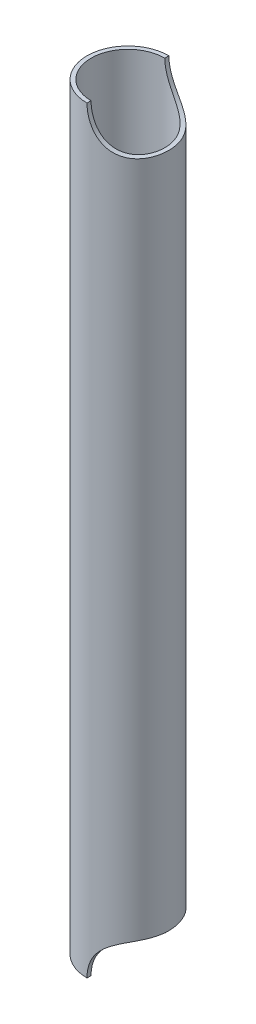
ISO-10303-21;
HEADER;
FILE_DESCRIPTION(('STEP AP214'),'2;1');
FILE_NAME('part.step','',(''),(''),'','','');
FILE_SCHEMA(('AUTOMOTIVE_DESIGN { 1 0 10303 214 1 1 1 1 }'));
ENDSEC;
DATA;
#1=APPLICATION_CONTEXT('core data for automotive mechanical design processes');
#2=APPLICATION_PROTOCOL_DEFINITION('international standard','automotive_design',2000,#1);
#3=PRODUCT_CONTEXT('',#1,'mechanical');
#4=PRODUCT('Part','Part','',(#3));
#5=PRODUCT_RELATED_PRODUCT_CATEGORY('part','',(#4));
#6=PRODUCT_DEFINITION_FORMATION('','',#4);
#7=PRODUCT_DEFINITION_CONTEXT('part definition',#1,'design');
#8=PRODUCT_DEFINITION('design','',#6,#7);
#9=PRODUCT_DEFINITION_SHAPE('','',#8);
#10=(LENGTH_UNIT() NAMED_UNIT(*) SI_UNIT(.MILLI.,.METRE.));
#11=(NAMED_UNIT(*) PLANE_ANGLE_UNIT() SI_UNIT($,.RADIAN.));
#12=(NAMED_UNIT(*) SI_UNIT($,.STERADIAN.) SOLID_ANGLE_UNIT());
#13=UNCERTAINTY_MEASURE_WITH_UNIT(LENGTH_MEASURE(1.E-05),#10,'distance_accuracy_value','');
#14=(GEOMETRIC_REPRESENTATION_CONTEXT(3) GLOBAL_UNCERTAINTY_ASSIGNED_CONTEXT((#13)) GLOBAL_UNIT_ASSIGNED_CONTEXT((#10,
#11,#12)) REPRESENTATION_CONTEXT('',''));
#15=CARTESIAN_POINT('',(0.,0.,0.));
#16=DIRECTION('',(0.,0.,1.));
#17=DIRECTION('',(1.,0.,0.));
#18=AXIS2_PLACEMENT_3D('',#15,#16,#17);
#19=CARTESIAN_POINT('',(0.,0.,0.));
#20=DIRECTION('',(0.,1.,0.));
#21=DIRECTION('',(0.,0.,1.));
#22=AXIS2_PLACEMENT_3D('',#19,#20,#21);
#23=PLANE('',#22);
#24=DIRECTION('',(0.,0.,1.));
#25=VECTOR('',#24,1.);
#26=CARTESIAN_POINT('',(0.,0.,-25.));
#27=LINE('',#26,#25);
#28=CARTESIAN_POINT('',(0.,0.,18.));
#29=VERTEX_POINT('',#28);
#30=CARTESIAN_POINT('',(0.,0.,20.));
#31=VERTEX_POINT('',#30);
#32=EDGE_CURVE('E56',#29,#31,#27,.T.);
#33=ORIENTED_EDGE('',*,*,#32,.T.);
#34=CARTESIAN_POINT('',(0.,0.,0.));
#35=DIRECTION('',(0.,1.,0.));
#36=DIRECTION('',(0.,0.,1.));
#37=AXIS2_PLACEMENT_3D('',#34,#35,#36);
#38=CIRCLE('',#37,20.);
#39=CARTESIAN_POINT('',(0.,0.,-20.));
#40=VERTEX_POINT('',#39);
#41=EDGE_CURVE('E97',#40,#31,#38,.T.);
#42=ORIENTED_EDGE('',*,*,#41,.F.);
#43=CARTESIAN_POINT('',(0.,0.,-18.));
#44=VERTEX_POINT('',#43);
#45=EDGE_CURVE('E87',#40,#44,#27,.T.);
#46=ORIENTED_EDGE('',*,*,#45,.T.);
#47=CARTESIAN_POINT('',(0.,0.,0.));
#48=DIRECTION('',(0.,1.,0.));
#49=DIRECTION('',(0.,0.,1.));
#50=AXIS2_PLACEMENT_3D('',#47,#48,#49);
#51=CIRCLE('',#50,18.);
#52=EDGE_CURVE('E102',#44,#29,#51,.T.);
#53=ORIENTED_EDGE('',*,*,#52,.T.);
#54=EDGE_LOOP('',(#33,#42,#46,#53));
#55=FACE_BOUND('',#54,.T.);
#56=ADVANCED_FACE('F34',(#55),#23,.F.);
#57=CARTESIAN_POINT('',(0.,370.,0.));
#58=DIRECTION('',(0.,-1.,0.));
#59=DIRECTION('',(0.,0.,-1.));
#60=AXIS2_PLACEMENT_3D('',#57,#58,#59);
#61=CYLINDRICAL_SURFACE('',#60,20.);
#62=CARTESIAN_POINT('',(0.,370.,0.));
#63=DIRECTION('',(0.,1.,0.));
#64=DIRECTION('',(0.,0.,1.));
#65=AXIS2_PLACEMENT_3D('',#62,#63,#64);
#66=CIRCLE('',#65,20.);
#67=CARTESIAN_POINT('',(0.,370.,-20.));
#68=VERTEX_POINT('',#67);
#69=CARTESIAN_POINT('',(0.,370.,20.));
#70=VERTEX_POINT('',#69);
#71=EDGE_CURVE('E92',#68,#70,#66,.T.);
#72=ORIENTED_EDGE('',*,*,#71,.F.);
#73=CARTESIAN_POINT('',(0.,370.,-20.));
#74=CARTESIAN_POINT('',(-3.06104600559937E-06,369.721618707315,-19.9999893506804));
#75=CARTESIAN_POINT('',(0.00581227517358233,369.443240815988,-19.9999997321841));
#76=CARTESIAN_POINT('',(0.029055060646602,368.886977421005,-19.9999850711208));
#77=CARTESIAN_POINT('',(0.0464822091236793,368.609091904782,-19.9999600294713));
#78=CARTESIAN_POINT('',(0.092923823321675,368.054285768103,-19.9997970442703));
#79=CARTESIAN_POINT('',(0.12193823082439,367.777365142806,-19.999659101286));
#80=CARTESIAN_POINT('',(0.19149481538049,367.224995071864,-19.9991128764201));
#81=CARTESIAN_POINT('',(0.232037268674741,366.949545661635,-19.99870458806));
#82=CARTESIAN_POINT('',(0.371039521708888,366.125124432942,-19.9967787556023));
#83=CARTESIAN_POINT('',(0.486803617486332,365.578922919936,-19.9945593607211));
#84=CARTESIAN_POINT('',(0.694297448400054,364.768584795034,-19.9880620741967));
#85=CARTESIAN_POINT('',(0.769106434341969,364.499957200638,-19.98536813534));
#86=CARTESIAN_POINT('',(0.929904514077298,363.965995909089,-19.9785325977727));
#87=CARTESIAN_POINT('',(1.01589676879598,363.700663166533,-19.9743905892075));
#88=CARTESIAN_POINT('',(1.29056947552188,362.909959500212,-19.9591640740678));
#89=CARTESIAN_POINT('',(1.49583821234951,362.390303410958,-19.9452811681699));
#90=CARTESIAN_POINT('',(1.94895280140816,361.370340198455,-19.9061104633644));
#91=CARTESIAN_POINT('',(2.19679599267575,360.870031868337,-19.8808233770736));
#92=CARTESIAN_POINT('',(2.59873676533621,360.13725797234,-19.8309032738408));
#93=CARTESIAN_POINT('',(2.73771900280118,359.89598937157,-19.812269365503));
#94=CARTESIAN_POINT('',(3.02539985532154,359.419814495336,-19.7703841714264));
#95=CARTESIAN_POINT('',(3.17409603898911,359.184906648448,-19.7471340381742));
#96=CARTESIAN_POINT('',(3.63428749109432,358.490366997608,-19.6694885800554));
#97=CARTESIAN_POINT('',(3.95993688558806,358.040825798644,-19.6071923537392));
#98=CARTESIAN_POINT('',(4.63170018762251,357.189935388517,-19.4592121823834));
#99=CARTESIAN_POINT('',(4.97652506439971,356.787391705802,-19.3745324010955));
#100=CARTESIAN_POINT('',(5.69312704219884,356.014617698228,-19.176194232153));
#101=CARTESIAN_POINT('',(6.0649035253786,355.644386633058,-19.0625365086422));
#102=CARTESIAN_POINT('',(6.82945421632089,354.939900589743,-18.8021639239921));
#103=CARTESIAN_POINT('',(7.2222008990967,354.605600106907,-18.6554916211243));
#104=CARTESIAN_POINT('',(8.02254971571631,353.975016895706,-18.3255518858566));
#105=CARTESIAN_POINT('',(8.43014925387275,353.678727565032,-18.1422908228785));
#106=CARTESIAN_POINT('',(9.19665424766341,353.163398877069,-17.7645285224411));
#107=CARTESIAN_POINT('',(9.5546275421295,352.939334546047,-17.5749608546811));
#108=CARTESIAN_POINT('',(10.2709734024261,352.520925692809,-17.1661609926113));
#109=CARTESIAN_POINT('',(10.6293459239999,352.32657815365,-16.9469318138972));
#110=CARTESIAN_POINT('',(11.3413874428653,351.967042238802,-16.4789096164042));
#111=CARTESIAN_POINT('',(11.695056188729,351.801855416076,-16.23011502429));
#112=CARTESIAN_POINT('',(12.392788825434,351.499325478486,-15.7038124287857));
#113=CARTESIAN_POINT('',(12.7368526597315,351.361982527508,-15.4263042564051));
#114=CARTESIAN_POINT('',(13.3913359878247,351.120377916521,-14.8609607175461));
#115=CARTESIAN_POINT('',(13.7025488779499,351.014658080903,-14.5746615457503));
#116=CARTESIAN_POINT('',(14.309277093163,350.824056780133,-13.9794555963432));
#117=CARTESIAN_POINT('',(14.6047932530538,350.739174205918,-13.6705500230952));
#118=CARTESIAN_POINT('',(15.1774684250058,350.587865943565,-13.0318260763331));
#119=CARTESIAN_POINT('',(15.4546236897073,350.521444014361,-12.7020034604842));
#120=CARTESIAN_POINT('',(15.9882767299572,350.404574274297,-12.0233683912128));
#121=CARTESIAN_POINT('',(16.2447730891725,350.354127557972,-11.6745546385391));
#122=CARTESIAN_POINT('',(16.7595566787178,350.262357977768,-10.9244730343548));
#123=CARTESIAN_POINT('',(17.015508494023,350.222432331692,-10.5214305407319));
#124=CARTESIAN_POINT('',(17.4983200494035,350.155579798451,-9.6972647505151));
#125=CARTESIAN_POINT('',(17.7251783442692,350.128653556843,-9.27614055710551));
#126=CARTESIAN_POINT('',(18.1483952912953,350.084758181751,-8.41811598721687));
#127=CARTESIAN_POINT('',(18.3447403806353,350.067793466813,-7.981208701043));
#128=CARTESIAN_POINT('',(18.705641326214,350.041107877916,-7.09424205112476));
#129=CARTESIAN_POINT('',(18.8701955678789,350.031387371802,-6.64418202072269));
#130=CARTESIAN_POINT('',(19.1851411427282,350.015907507505,-5.67632634272882));
#131=CARTESIAN_POINT('',(19.331185371609,350.0107958206,-5.15710045307549));
#132=CARTESIAN_POINT('',(19.5808749582457,350.004002075562,-4.10851128564528));
#133=CARTESIAN_POINT('',(19.6845171953678,350.002320269819,-3.57914726473863));
#134=CARTESIAN_POINT('',(19.8487237449098,350.000403123086,-2.51370598792182));
#135=CARTESIAN_POINT('',(19.9092827596959,350.000167959953,-1.97762791467719));
#136=CARTESIAN_POINT('',(19.9869050819649,349.999966752304,-0.90233661688352));
#137=CARTESIAN_POINT('',(20.0039682222223,350.000000708824,-0.363123380288917));
#138=CARTESIAN_POINT('',(19.9942882550485,349.999999292376,0.737255269632946));
#139=CARTESIAN_POINT('',(19.9657024475769,349.999960991164,1.29840537546465));
#140=CARTESIAN_POINT('',(19.8614334433283,350.000412535475,2.41632836046391));
#141=CARTESIAN_POINT('',(19.7857484344594,350.000902401318,2.97310107038117));
#142=CARTESIAN_POINT('',(19.587779689781,350.004003737293,4.07851456640564));
#143=CARTESIAN_POINT('',(19.4654784004514,350.006616007044,4.62715220827664));
#144=CARTESIAN_POINT('',(19.1751568657338,350.016489071947,5.71215658030807));
#145=CARTESIAN_POINT('',(19.0071368482487,350.023749843927,6.24852337162291));
#146=CARTESIAN_POINT('',(18.6264345512917,350.046311317273,7.30560160878698));
#147=CARTESIAN_POINT('',(18.4137088710125,350.061619853352,7.82629727520562));
#148=CARTESIAN_POINT('',(17.9453700253641,350.104428628878,8.8475559629032));
#149=CARTESIAN_POINT('',(17.6897560275427,350.131929104985,9.34811859317083));
#150=CARTESIAN_POINT('',(17.137960234046,350.203887039146,10.3249640353113));
#151=CARTESIAN_POINT('',(16.8417887830804,350.248340178344,10.8012529961305));
#152=CARTESIAN_POINT('',(16.2118378410108,350.359428392552,11.7255702821595));
#153=CARTESIAN_POINT('',(15.8780612792735,350.426061740555,12.1736008044127));
#154=CARTESIAN_POINT('',(15.19439235619,350.582923344904,13.0157500015868));
#155=CARTESIAN_POINT('',(14.846133933121,350.671809122032,13.4114430261319));
#156=CARTESIAN_POINT('',(14.1237218431699,350.879056707824,14.1702076914532));
#157=CARTESIAN_POINT('',(13.7495690170156,350.997417559829,14.5332803904527));
#158=CARTESIAN_POINT('',(12.9814631828314,351.267525874647,15.2232637309192));
#159=CARTESIAN_POINT('',(12.587537972895,351.419227424869,15.5502231816108));
#160=CARTESIAN_POINT('',(11.7860780944927,351.75936405567,16.1661265430257));
#161=CARTESIAN_POINT('',(11.3785457368549,351.947792925078,16.455076867875));
#162=CARTESIAN_POINT('',(10.6138684815525,352.334832703296,16.9565710680763));
#163=CARTESIAN_POINT('',(10.2575024228912,352.528478881242,17.1741577535538));
#164=CARTESIAN_POINT('',(9.54526037917844,352.945131073016,17.5799871132146));
#165=CARTESIAN_POINT('',(9.18938434733509,353.168134054027,17.7682328141992));
#166=CARTESIAN_POINT('',(8.4831078406835,353.643277622447,18.1160676509604));
#167=CARTESIAN_POINT('',(8.13270775675798,353.895420279209,18.2756547494894));
#168=CARTESIAN_POINT('',(7.44214510729254,354.42789764405,18.5675801558388));
#169=CARTESIAN_POINT('',(7.10198265995073,354.70823267746,18.6999181491589));
#170=CARTESIAN_POINT('',(6.45326770422073,355.280507287976,18.9332522024531));
#171=CARTESIAN_POINT('',(6.14398875756981,355.571114417551,19.0355075579297));
#172=CARTESIAN_POINT('',(5.54166626206664,356.174720078352,19.2194982160384));
#173=CARTESIAN_POINT('',(5.24862193953767,356.487717540915,19.3012344971836));
#174=CARTESIAN_POINT('',(4.68136548527225,357.134368520702,19.4466086654466));
#175=CARTESIAN_POINT('',(4.40715674165102,357.468025733754,19.5102433029014));
#176=CARTESIAN_POINT('',(3.87979781354684,358.154059084235,19.6219222927514));
#177=CARTESIAN_POINT('',(3.6266490078961,358.506436444836,19.6699656249521));
#178=CARTESIAN_POINT('',(3.11821096285406,359.265255757798,19.757277641847));
#179=CARTESIAN_POINT('',(2.86540048367341,359.673522946101,19.7951277832129));
#180=CARTESIAN_POINT('',(2.38945266276618,360.507930938412,19.8582014391863));
#181=CARTESIAN_POINT('',(2.16631726782058,360.934072912654,19.8834241256919));
#182=CARTESIAN_POINT('',(1.75106214407027,361.801961969699,19.9242904354029));
#183=CARTESIAN_POINT('',(1.55896159619756,362.243718499024,19.9399281512178));
#184=CARTESIAN_POINT('',(1.20708142532985,363.140110739525,19.9643198185056));
#185=CARTESIAN_POINT('',(1.04730324676047,363.594747025239,19.9730734623928));
#186=CARTESIAN_POINT('',(0.754557980330625,364.535010502068,19.9863226803634));
#187=CARTESIAN_POINT('',(0.623110034606531,365.02111424479,19.9906102521334));
#188=CARTESIAN_POINT('',(0.397239785224947,366.001866659971,19.9963737087501));
#189=CARTESIAN_POINT('',(0.302819207830794,366.496515729701,19.9978494625187));
#190=CARTESIAN_POINT('',(0.15159834042811,367.491254338028,19.999569262236));
#191=CARTESIAN_POINT('',(0.0947734171827032,367.991340095629,19.9998141153847));
#192=CARTESIAN_POINT('',(0.0379236439354409,368.743501938647,19.9999716442632));
#193=CARTESIAN_POINT('',(0.0237049866497329,368.99457924861,19.9999891892373));
#194=CARTESIAN_POINT('',(0.00474316660908787,369.497096196535,20.000000694534));
#195=CARTESIAN_POINT('',(1.83417679422026E-07,369.748535841272,19.9999946544098));
#196=CARTESIAN_POINT('',(0.,370.,20.));
#197=B_SPLINE_CURVE_WITH_KNOTS('',3,(#73,#74,#75,#76,#77,#78,#79,#80,#81,#82,#83,#84,#85,#86,
#87,#88,#89,#90,#91,#92,#93,#94,#95,#96,#97,#98,#99,#100,#101,#102,#103,#104,#105,#106,#107,
#108,#109,#110,#111,#112,#113,#114,#115,#116,#117,#118,#119,#120,#121,#122,#123,#124,#125,#126,
#127,#128,#129,#130,#131,#132,#133,#134,#135,#136,#137,#138,#139,#140,#141,#142,#143,#144,#145,
#146,#147,#148,#149,#150,#151,#152,#153,#154,#155,#156,#157,#158,#159,#160,#161,#162,#163,#164,
#165,#166,#167,#168,#169,#170,#171,#172,#173,#174,#175,#176,#177,#178,#179,#180,#181,#182,#183,
#184,#185,#186,#187,#188,#189,#190,#191,#192,#193,#194,#195,#196),.UNSPECIFIED.,.F.,.F.,(4,2,2,
2,2,2,2,2,2,2,2,2,2,2,2,2,2,2,2,2,2,2,2,2,2,2,2,2,2,2,2,2,2,2,2,2,2,2,2,2,2,2,2,2,2,2,2,2,2,2,2,
2,2,2,2,2,2,2,2,2,2,4),(0.,0.835076485595751,1.6701313413639,2.50518200159435,3.34025267341771,
5.01292525098713,5.8493179684489,6.68594760628963,8.3605041614688,10.0349560925573,
10.8718849415026,11.7086051049933,13.3817268500394,14.9897573907218,16.5977510803505,
18.2036836971141,19.8093369942811,21.1962193447255,22.5829608008564,23.9697760860677,
25.3565995336854,26.66286725989,27.9690654448479,29.2755294016961,30.5820828509762,
32.017952832629,33.4538941129742,34.8904718407489,36.3271225093717,37.9434994468826,
39.5599953225238,41.1766899326945,42.7933907584476,44.4770185595549,46.1607111404629,
47.8450383489246,49.5293571613503,51.2153187478653,52.9013130622821,54.5868781399788,
56.2723120060271,57.8736886662662,59.4750133580925,61.0741465729394,62.6730095832948,
64.0519717602324,65.4307915898356,66.8097093965347,68.1886431173551,69.496858735585,
70.8050119558087,72.1133998717578,73.4218733829236,74.8654742199874,76.3091697152418,
77.7537540937544,79.1984030137593,80.7076781862071,82.2170237146336,83.7253793152316,
84.479663807601,85.2339625934864),.UNSPECIFIED.);
#198=EDGE_CURVE('E79',#68,#70,#197,.T.);
#199=ORIENTED_EDGE('',*,*,#198,.T.);
#200=EDGE_LOOP('',(#72,#199));
#201=FACE_BOUND('',#200,.T.);
#202=CARTESIAN_POINT('',(0.,0.,-20.));
#203=CARTESIAN_POINT('',(-3.06104601949444E-06,0.278381292685202,-19.9999893506804));
#204=CARTESIAN_POINT('',(0.00581227517356356,0.556759184012306,-19.9999997321841));
#205=CARTESIAN_POINT('',(0.02905506064658,1.11302257899515,-19.9999850711208));
#206=CARTESIAN_POINT('',(0.0464822091236599,1.39090809521777,-19.9999600294713));
#207=CARTESIAN_POINT('',(0.0929238233216565,1.94571423189697,-19.9997970442703));
#208=CARTESIAN_POINT('',(0.12193823082437,2.22263485719443,-19.999659101286));
#209=CARTESIAN_POINT('',(0.191494815380472,2.7750049281359,-19.9991128764201));
#210=CARTESIAN_POINT('',(0.232037268674725,3.05045433836476,-19.99870458806));
#211=CARTESIAN_POINT('',(0.371039521708878,3.87487556705794,-19.9967787556023));
#212=CARTESIAN_POINT('',(0.486803617486322,4.42107708006374,-19.9945593607211));
#213=CARTESIAN_POINT('',(0.694297448400039,5.23141520496648,-19.9880620741967));
#214=CARTESIAN_POINT('',(0.76910643434195,5.50004279936197,-19.98536813534));
#215=CARTESIAN_POINT('',(0.92990451407728,6.03400409091147,-19.9785325977727));
#216=CARTESIAN_POINT('',(1.01589676879597,6.29933683346693,-19.9743905892075));
#217=CARTESIAN_POINT('',(1.29056947552188,7.09004049978803,-19.9591640740679));
#218=CARTESIAN_POINT('',(1.4958382123495,7.60969658904237,-19.9452811681699));
#219=CARTESIAN_POINT('',(1.94895280140815,8.62965980154511,-19.9061104633644));
#220=CARTESIAN_POINT('',(2.19679599267574,9.12996813166293,-19.8808233770736));
#221=CARTESIAN_POINT('',(2.5987367653362,9.86274202766004,-19.8309032738408));
#222=CARTESIAN_POINT('',(2.73771900280116,10.1040106284301,-19.812269365503));
#223=CARTESIAN_POINT('',(3.02539985532152,10.5801855046641,-19.7703841714264));
#224=CARTESIAN_POINT('',(3.17409603898909,10.8150933515522,-19.7471340381742));
#225=CARTESIAN_POINT('',(3.6342874910943,11.5096330023915,-19.6694885800554));
#226=CARTESIAN_POINT('',(3.95993688558805,11.9591742013562,-19.6071923537392));
#227=CARTESIAN_POINT('',(4.63170018762252,12.8100646114835,-19.4592121823834));
#228=CARTESIAN_POINT('',(4.97652506439972,13.2126082941977,-19.3745324010955));
#229=CARTESIAN_POINT('',(5.69312704219885,13.9853823017717,-19.176194232153));
#230=CARTESIAN_POINT('',(6.06490352537861,14.3556133669417,-19.0625365086422));
#231=CARTESIAN_POINT('',(6.8294542163209,15.0600994102571,-18.8021639239921));
#232=CARTESIAN_POINT('',(7.22220089909671,15.3943998930928,-18.6554916211243));
#233=CARTESIAN_POINT('',(8.02254971571634,16.0249831042939,-18.3255518858566));
#234=CARTESIAN_POINT('',(8.43014925387278,16.321272434968,-18.1422908228785));
#235=CARTESIAN_POINT('',(9.19665424766344,16.8366011229314,-17.7645285224411));
#236=CARTESIAN_POINT('',(9.55462754212953,17.0606654539532,-17.5749608546811));
#237=CARTESIAN_POINT('',(10.2709734024262,17.4790743071909,-17.1661609926113));
#238=CARTESIAN_POINT('',(10.6293459239999,17.6734218463498,-16.9469318138972));
#239=CARTESIAN_POINT('',(11.3413874428653,18.032957761198,-16.4789096164042));
#240=CARTESIAN_POINT('',(11.6950561887291,18.1981445839244,-16.23011502429));
#241=CARTESIAN_POINT('',(12.392788825434,18.5006745215145,-15.7038124287856));
#242=CARTESIAN_POINT('',(12.7368526597315,18.6380174724922,-15.4263042564051));
#243=CARTESIAN_POINT('',(13.3913359878247,18.8796220834792,-14.8609607175461));
#244=CARTESIAN_POINT('',(13.7025488779499,18.9853419190975,-14.5746615457503));
#245=CARTESIAN_POINT('',(14.309277093163,19.1759432198669,-13.9794555963432));
#246=CARTESIAN_POINT('',(14.6047932530538,19.2608257940823,-13.6705500230952));
#247=CARTESIAN_POINT('',(15.1774684250058,19.4121340564348,-13.0318260763331));
#248=CARTESIAN_POINT('',(15.4546236897074,19.4785559856388,-12.7020034604842));
#249=CARTESIAN_POINT('',(15.9882767299572,19.5954257257029,-12.0233683912128));
#250=CARTESIAN_POINT('',(16.2447730891725,19.6458724420284,-11.6745546385391));
#251=CARTESIAN_POINT('',(16.7595566787178,19.7376420222323,-10.9244730343547));
#252=CARTESIAN_POINT('',(17.015508494023,19.777567668308,-10.5214305407319));
#253=CARTESIAN_POINT('',(17.4983200494035,19.8444202015488,-9.69726475051509));
#254=CARTESIAN_POINT('',(17.7251783442692,19.871346443157,-9.27614055710549));
#255=CARTESIAN_POINT('',(18.1483952912953,19.9152418182489,-8.41811598721685));
#256=CARTESIAN_POINT('',(18.3447403806353,19.9322065331873,-7.98120870104298));
#257=CARTESIAN_POINT('',(18.7056413262141,19.9588921220835,-7.09424205112473));
#258=CARTESIAN_POINT('',(18.8701955678789,19.9686126281985,-6.64418202072266));
#259=CARTESIAN_POINT('',(19.1851411427282,19.9840924924952,-5.67632634272878));
#260=CARTESIAN_POINT('',(19.331185371609,19.9892041793999,-5.15710045307546));
#261=CARTESIAN_POINT('',(19.5808749582457,19.9959979244382,-4.10851128564524));
#262=CARTESIAN_POINT('',(19.6845171953678,19.9976797301811,-3.57914726473858));
#263=CARTESIAN_POINT('',(19.8487237449098,19.9995968769138,-2.51370598792177));
#264=CARTESIAN_POINT('',(19.9092827596959,19.9998320400474,-1.97762791467715));
#265=CARTESIAN_POINT('',(19.9869050819649,20.0000332476958,-0.902336616883479));
#266=CARTESIAN_POINT('',(20.0039682222223,19.9999992911758,-0.363123380288873));
#267=CARTESIAN_POINT('',(19.9942882550485,20.0000007076244,0.73725526963299));
#268=CARTESIAN_POINT('',(19.9657024475769,20.0000390088359,1.29840537546469));
#269=CARTESIAN_POINT('',(19.8614334433283,19.9995874645255,2.41632836046395));
#270=CARTESIAN_POINT('',(19.7857484344593,19.9990975986823,2.97310107038121));
#271=CARTESIAN_POINT('',(19.587779689781,19.9959962627067,4.07851456640568));
#272=CARTESIAN_POINT('',(19.4654784004514,19.993383992956,4.62715220827668));
#273=CARTESIAN_POINT('',(19.1751568657338,19.9835109280529,5.71215658030811));
#274=CARTESIAN_POINT('',(19.0071368482487,19.9762501560726,6.24852337162295));
#275=CARTESIAN_POINT('',(18.6264345512917,19.9536886827268,7.30560160878702));
#276=CARTESIAN_POINT('',(18.4137088710125,19.9383801466485,7.82629727520566));
#277=CARTESIAN_POINT('',(17.945370025364,19.8955713711223,8.84755596290323));
#278=CARTESIAN_POINT('',(17.6897560275427,19.8680708950147,9.34811859317087));
#279=CARTESIAN_POINT('',(17.1379602340459,19.7961129608543,10.3249640353114));
#280=CARTESIAN_POINT('',(16.8417887830804,19.7516598216563,10.8012529961305));
#281=CARTESIAN_POINT('',(16.2118378410108,19.640571607448,11.7255702821595));
#282=CARTESIAN_POINT('',(15.8780612792735,19.5739382594446,12.1736008044127));
#283=CARTESIAN_POINT('',(15.19439235619,19.4170766550962,13.0157500015868));
#284=CARTESIAN_POINT('',(14.846133933121,19.3281908779681,13.4114430261319));
#285=CARTESIAN_POINT('',(14.1237218431698,19.1209432921757,14.1702076914532));
#286=CARTESIAN_POINT('',(13.7495690170155,19.0025824401711,14.5332803904527));
#287=CARTESIAN_POINT('',(12.9814631828314,18.7324741253526,15.2232637309192));
#288=CARTESIAN_POINT('',(12.587537972895,18.5807725751311,15.5502231816108));
#289=CARTESIAN_POINT('',(11.7860780944927,18.2406359443297,16.1661265430257));
#290=CARTESIAN_POINT('',(11.3785457368549,18.0522070749215,16.455076867875));
#291=CARTESIAN_POINT('',(10.6138684815525,17.665167296704,16.9565710680763));
#292=CARTESIAN_POINT('',(10.2575024228912,17.471521118758,17.1741577535539));
#293=CARTESIAN_POINT('',(9.54526037917844,17.0548689269842,17.5799871132146));
#294=CARTESIAN_POINT('',(9.18938434733508,16.8318659459734,17.7682328141992));
#295=CARTESIAN_POINT('',(8.48310784068348,16.3567223775534,18.1160676509605));
#296=CARTESIAN_POINT('',(8.13270775675795,16.1045797207908,18.2756547494895));
#297=CARTESIAN_POINT('',(7.44214510729251,15.57210235595,18.5675801558388));
#298=CARTESIAN_POINT('',(7.10198265995071,15.2917673225403,18.6999181491589));
#299=CARTESIAN_POINT('',(6.4532677042207,14.7194927120237,18.9332522024531));
#300=CARTESIAN_POINT('',(6.14398875756976,14.4288855824493,19.0355075579297));
#301=CARTESIAN_POINT('',(5.54166626206659,13.8252799216477,19.2194982160384));
#302=CARTESIAN_POINT('',(5.24862193953763,13.5122824590852,19.3012344971836));
#303=CARTESIAN_POINT('',(4.68136548527223,12.8656314792981,19.4466086654466));
#304=CARTESIAN_POINT('',(4.407156741651,12.5319742662461,19.5102433029014));
#305=CARTESIAN_POINT('',(3.87979781354681,11.8459409157647,19.6219222927514));
#306=CARTESIAN_POINT('',(3.62664900789607,11.4935635551644,19.6699656249521));
#307=CARTESIAN_POINT('',(3.11821096285403,10.7347442422023,19.757277641847));
#308=CARTESIAN_POINT('',(2.86540048367339,10.326477053899,19.7951277832129));
#309=CARTESIAN_POINT('',(2.38945266276615,9.49206906158783,19.8582014391863));
#310=CARTESIAN_POINT('',(2.16631726782055,9.06592708734645,19.8834241256919));
#311=CARTESIAN_POINT('',(1.75106214407024,8.19803803030058,19.9242904354029));
#312=CARTESIAN_POINT('',(1.55896159619753,7.75628150097601,19.9399281512178));
#313=CARTESIAN_POINT('',(1.20708142532983,6.85988926047467,19.9643198185056));
#314=CARTESIAN_POINT('',(1.04730324676044,6.4052529747605,19.9730734623928));
#315=CARTESIAN_POINT('',(0.754557980330594,5.46498949793172,19.9863226803634));
#316=CARTESIAN_POINT('',(0.623110034606501,4.97888575520966,19.9906102521334));
#317=CARTESIAN_POINT('',(0.397239785224924,3.99813334002903,19.9963737087501));
#318=CARTESIAN_POINT('',(0.302819207830774,3.50348427029856,19.9978494625187));
#319=CARTESIAN_POINT('',(0.151598340428092,2.50874566197214,19.999569262236));
#320=CARTESIAN_POINT('',(0.0947734171826853,2.00865990437073,19.9998141153847));
#321=CARTESIAN_POINT('',(0.0379236439354251,1.25649806135333,19.9999716442632));
#322=CARTESIAN_POINT('',(0.0237049866497183,1.00542075138969,19.9999891892373));
#323=CARTESIAN_POINT('',(0.0047431666090721,0.502903803465075,20.000000694534));
#324=CARTESIAN_POINT('',(1.8341766284555E-07,0.25146415872824,19.9999946544098));
#325=CARTESIAN_POINT('',(0.,0.,20.));
#326=B_SPLINE_CURVE_WITH_KNOTS('',3,(#202,#203,#204,#205,#206,#207,#208,#209,#210,#211,#212,
#213,#214,#215,#216,#217,#218,#219,#220,#221,#222,#223,#224,#225,#226,#227,#228,#229,#230,#231,
#232,#233,#234,#235,#236,#237,#238,#239,#240,#241,#242,#243,#244,#245,#246,#247,#248,#249,#250,
#251,#252,#253,#254,#255,#256,#257,#258,#259,#260,#261,#262,#263,#264,#265,#266,#267,#268,#269,
#270,#271,#272,#273,#274,#275,#276,#277,#278,#279,#280,#281,#282,#283,#284,#285,#286,#287,#288,
#289,#290,#291,#292,#293,#294,#295,#296,#297,#298,#299,#300,#301,#302,#303,#304,#305,#306,#307,
#308,#309,#310,#311,#312,#313,#314,#315,#316,#317,#318,#319,#320,#321,#322,#323,#324,#325),
.UNSPECIFIED.,.F.,.F.,(4,2,2,2,2,2,2,2,2,2,2,2,2,2,2,2,2,2,2,2,2,2,2,2,2,2,2,2,2,2,2,2,2,2,2,2,
2,2,2,2,2,2,2,2,2,2,2,2,2,2,2,2,2,2,2,2,2,2,2,2,2,4),(0.,0.835076485595706,1.67013134136387,
2.50518200159437,3.34025267341771,5.01292525098716,5.84931796844893,6.68594760628965,
8.36050416146882,10.0349560925573,10.8718849415026,11.7086051049933,13.3817268500394,
14.9897573907218,16.5977510803505,18.2036836971142,19.8093369942812,21.1962193447256,
22.5829608008565,23.9697760860677,25.3565995336854,26.66286725989,27.9690654448479,
29.2755294016961,30.5820828509762,32.017952832629,33.4538941129742,34.8904718407489,
36.3271225093718,37.9434994468826,39.5599953225238,41.1766899326946,42.7933907584477,
44.4770185595549,46.1607111404629,47.8450383489246,49.5293571613504,51.2153187478653,
52.9013130622822,54.5868781399788,56.2723120060271,57.8736886662663,59.4750133580926,
61.0741465729394,62.6730095832949,64.0519717602324,65.4307915898356,66.8097093965348,
68.1886431173551,69.496858735585,70.8050119558088,72.1133998717579,73.4218733829236,
74.8654742199874,76.3091697152419,77.7537540937545,79.1984030137594,80.7076781862072,
82.2170237146337,83.7253793152317,84.4796638076009,85.2339625934864),.UNSPECIFIED.);
#327=EDGE_CURVE('E86',#40,#31,#326,.T.);
#328=ORIENTED_EDGE('',*,*,#327,.F.);
#329=ORIENTED_EDGE('',*,*,#41,.T.);
#330=EDGE_LOOP('',(#328,#329));
#331=FACE_BOUND('',#330,.T.);
#332=ADVANCED_FACE('F36',(#201,#331),#61,.T.);
#333=CARTESIAN_POINT('',(0.,370.,0.));
#334=DIRECTION('',(0.,-1.,0.));
#335=DIRECTION('',(0.,0.,-1.));
#336=AXIS2_PLACEMENT_3D('',#333,#334,#335);
#337=CYLINDRICAL_SURFACE('',#336,18.);
#338=CARTESIAN_POINT('',(0.,370.,-18.));
#339=CARTESIAN_POINT('',(-3.06925014369441E-06,369.721361472762,-17.9999881249312));
#340=CARTESIAN_POINT('',(0.00582302296922062,369.44272636963,-17.999999701963));
#341=CARTESIAN_POINT('',(0.0291087567421984,368.885950157997,-17.9999833503419));
#342=CARTESIAN_POINT('',(0.0465680863538542,368.607809036451,-17.9999554227483));
#343=CARTESIAN_POINT('',(0.0930959103281516,368.052488326723,-17.9997736591112));
#344=CARTESIAN_POINT('',(0.12216459758597,367.775308754595,-17.9996198209755));
#345=CARTESIAN_POINT('',(0.191851347258406,367.222424801479,-17.9990106249913));
#346=CARTESIAN_POINT('',(0.232469699110668,366.946720457638,-17.998555259586));
#347=CARTESIAN_POINT('',(0.371843064464254,366.120884793345,-17.9964057312382));
#348=CARTESIAN_POINT('',(0.487989994296174,365.57354015662,-17.9939263714461));
#349=CARTESIAN_POINT('',(0.696197172849964,364.761547635674,-17.9866621957028));
#350=CARTESIAN_POINT('',(0.771266388630648,364.492380753156,-17.9836498251702));
#351=CARTESIAN_POINT('',(0.932630184598965,363.957361140536,-17.9760044623381));
#352=CARTESIAN_POINT('',(1.01892804815866,363.691509404832,-17.9713709953414));
#353=CARTESIAN_POINT('',(1.29465976446467,362.899064428516,-17.9543297167767));
#354=CARTESIAN_POINT('',(1.50076387552661,362.378235856911,-17.9387846509949));
#355=CARTESIAN_POINT('',(1.95570665872602,361.356142291994,-17.8948979891677));
#356=CARTESIAN_POINT('',(2.20454179729865,360.854875685243,-17.8665574509052));
#357=CARTESIAN_POINT('',(2.60783620182549,360.121211656816,-17.8106010507744));
#358=CARTESIAN_POINT('',(2.74716037454368,359.879868254942,-17.7897284023734));
#359=CARTESIAN_POINT('',(3.03550546906459,359.403615550243,-17.7428028294065));
#360=CARTESIAN_POINT('',(3.18452408749357,359.168704737764,-17.7167511323661));
#361=CARTESIAN_POINT('',(3.49185444053671,358.705829120378,-17.6587484376575));
#362=CARTESIAN_POINT('',(3.65016503003444,358.477863464807,-17.6267981658763));
#363=CARTESIAN_POINT('',(3.97560604776202,358.029386553697,-17.5562604770313));
#364=CARTESIAN_POINT('',(4.14273652974947,357.808875343606,-17.5176730195104));
#365=CARTESIAN_POINT('',(4.58534653747765,357.249330426654,-17.4084085692725));
#366=CARTESIAN_POINT('',(4.86710175935302,356.916285119263,-17.3321516660706));
#367=CARTESIAN_POINT('',(5.44868361132961,356.272385151773,-17.1582031044604));
#368=CARTESIAN_POINT('',(5.74850775547882,355.961527451864,-17.060514389815));
#369=CARTESIAN_POINT('',(6.36280806167282,355.364071164976,-16.8410494277227));
#370=CARTESIAN_POINT('',(6.67727474633584,355.077457215547,-16.7192885997263));
#371=CARTESIAN_POINT('',(7.31712549030267,354.529965056506,-16.4493224962811));
#372=CARTESIAN_POINT('',(7.64250970725025,354.269087218724,-16.3011168388486));
#373=CARTESIAN_POINT('',(8.30117104258407,353.773229708198,-15.9757951324046));
#374=CARTESIAN_POINT('',(8.63447673582811,353.53836985552,-15.7985539467664));
#375=CARTESIAN_POINT('',(9.3026196605845,353.096554322771,-15.4145934895463));
#376=CARTESIAN_POINT('',(9.63745689257065,352.889598651333,-15.207874208844));
#377=CARTESIAN_POINT('',(10.3035331794917,352.503521675463,-14.7647285300713));
#378=CARTESIAN_POINT('',(10.6347720200275,352.324402021188,-14.5283003723213));
#379=CARTESIAN_POINT('',(11.2885655588601,351.993189487528,-14.0263361935859));
#380=CARTESIAN_POINT('',(11.6111205781975,351.841095607834,-13.7608012505232));
#381=CARTESIAN_POINT('',(12.2197485614721,351.572570435208,-13.2223530267793));
#382=CARTESIAN_POINT('',(12.5067655865673,351.454345986267,-12.9513944140278));
#383=CARTESIAN_POINT('',(13.0659332646634,351.2381081072,-12.3870560805402));
#384=CARTESIAN_POINT('',(13.3380847489945,351.140093546017,-12.0936776158019));
#385=CARTESIAN_POINT('',(13.8646856170903,350.962269143566,-11.4861715021085));
#386=CARTESIAN_POINT('',(14.1191315324358,350.882462862256,-11.1720398110792));
#387=CARTESIAN_POINT('',(14.6078475923962,350.738910268666,-10.5249800387698));
#388=CARTESIAN_POINT('',(14.8421165991417,350.675164861743,-10.192050899165));
#389=CARTESIAN_POINT('',(15.3018269975782,350.558118165743,-9.4889871234255));
#390=CARTESIAN_POINT('',(15.5259033233561,350.50566910622,-9.11781812541133));
#391=CARTESIAN_POINT('',(15.947249652636,350.41373622281,-8.35904205460204));
#392=CARTESIAN_POINT('',(16.1445189171793,350.374252756288,-7.97143452905156));
#393=CARTESIAN_POINT('',(16.5108264761527,350.305828007752,-7.18206068702038));
#394=CARTESIAN_POINT('',(16.6798555433083,350.276890167809,-6.78028979448963));
#395=CARTESIAN_POINT('',(16.9884583262353,350.227417019611,-5.96508745316545));
#396=CARTESIAN_POINT('',(17.1280306206634,350.206882116769,-5.55165544279239));
#397=CARTESIAN_POINT('',(17.3895505655931,350.17060838472,-4.6727549768762));
#398=CARTESIAN_POINT('',(17.5082411623151,350.155573809234,-4.20628522485121));
#399=CARTESIAN_POINT('',(17.7079087965812,350.131521754172,-3.26517929536936));
#400=CARTESIAN_POINT('',(17.7888835312468,350.122504642,-2.79054262108578));
#401=CARTESIAN_POINT('',(17.9125692172282,350.109134924978,-1.83614859982725));
#402=CARTESIAN_POINT('',(17.9552726725206,350.10478323389,-1.35639026830889));
#403=CARTESIAN_POINT('',(18.0021008680016,350.100026462386,-0.394977216725632));
#404=CARTESIAN_POINT('',(18.0062252308356,350.099621420573,0.0866775218425289));
#405=CARTESIAN_POINT('',(17.975221941682,350.102750058323,1.06912174123733));
#406=CARTESIAN_POINT('',(17.9384267897655,350.106451046461,1.56985893261166));
#407=CARTESIAN_POINT('',(17.8231558597604,350.118735083873,2.56646871423187));
#408=CARTESIAN_POINT('',(17.7446785180716,350.127318316293,3.06234112127714));
#409=CARTESIAN_POINT('',(17.5465968543706,350.150799649019,4.04581494081285));
#410=CARTESIAN_POINT('',(17.4269801154351,350.165699656205,4.53341380945862));
#411=CARTESIAN_POINT('',(17.1475533508849,350.203954484899,5.49662285979792));
#412=CARTESIAN_POINT('',(16.9877437615808,350.227309214629,5.97223317157071));
#413=CARTESIAN_POINT('',(16.6295545000476,350.285210254453,6.90710137456273));
#414=CARTESIAN_POINT('',(16.4312399003386,350.319737747574,7.3663853289732));
#415=CARTESIAN_POINT('',(15.9976624403756,350.403316339616,8.26583437827707));
#416=CARTESIAN_POINT('',(15.7623990789719,350.452367635538,8.70599921374739));
#417=CARTESIAN_POINT('',(15.2574563830662,350.568702105566,9.56333485188014));
#418=CARTESIAN_POINT('',(14.9877942929313,350.635976163306,9.98051702691477));
#419=CARTESIAN_POINT('',(14.4171320149448,350.792733820603,10.7884576430662));
#420=CARTESIAN_POINT('',(14.1161345053303,350.882215522977,11.1792183377247));
#421=CARTESIAN_POINT('',(13.5054930817786,351.081271949573,11.9085820256059));
#422=CARTESIAN_POINT('',(13.1974125575568,351.189345898497,12.2489028289765));
#423=CARTESIAN_POINT('',(12.5613339750415,351.431693445744,12.9003909399301));
#424=CARTESIAN_POINT('',(12.2333368170501,351.56596586041,13.21155956368));
#425=CARTESIAN_POINT('',(11.5627276768665,351.863110247651,13.8022760533833));
#426=CARTESIAN_POINT('',(11.2201291799745,352.025956246152,14.0818522613491));
#427=CARTESIAN_POINT('',(10.5257045812935,352.382114682756,14.6081932954334));
#428=CARTESIAN_POINT('',(10.1738793773758,352.575424165494,14.8549613001098));
#429=CARTESIAN_POINT('',(9.50471329525693,352.971095583302,15.2906018879319));
#430=CARTESIAN_POINT('',(9.18768914292045,353.170302336548,15.4828412728603));
#431=CARTESIAN_POINT('',(8.5554683123148,353.593678648719,15.8409574036602));
#432=CARTESIAN_POINT('',(8.24027148810207,353.817846184378,16.0068362836165));
#433=CARTESIAN_POINT('',(7.6158317086446,354.290583657334,16.3131883362843));
#434=CARTESIAN_POINT('',(7.30658971987013,354.539157516511,16.4536574155243));
#435=CARTESIAN_POINT('',(6.697941267798,355.059599238663,16.7106775217486));
#436=CARTESIAN_POINT('',(6.39853516389779,355.331467951512,16.8272276755642));
#437=CARTESIAN_POINT('',(5.81338357665327,355.896626650584,17.0382273013846));
#438=CARTESIAN_POINT('',(5.52761854367506,356.189884359162,17.1327092062185));
#439=CARTESIAN_POINT('',(4.97212917711911,356.796505821659,17.3020885688024));
#440=CARTESIAN_POINT('',(4.7024046858415,357.109869377848,17.3769862191162));
#441=CARTESIAN_POINT('',(4.18125276833243,357.755031127679,17.5096964872838));
#442=CARTESIAN_POINT('',(3.9298312473883,358.086835210634,17.5675036092875));
#443=CARTESIAN_POINT('',(3.44726027115974,358.766980606737,17.6685364737021));
#444=CARTESIAN_POINT('',(3.21611205724824,359.115322930542,17.7117613236736));
#445=CARTESIAN_POINT('',(2.74563968765656,359.875134421323,17.7911744310535));
#446=CARTESIAN_POINT('',(2.50947682729401,360.288747109643,17.8256069445912));
#447=CARTESIAN_POINT('',(2.06697586638005,361.132439789175,17.8823204771024));
#448=CARTESIAN_POINT('',(1.86064071396715,361.562521402851,17.9046002955194));
#449=CARTESIAN_POINT('',(1.47903633926611,362.43683106365,17.9401560461843));
#450=CARTESIAN_POINT('',(1.30378131805076,362.881065468643,17.9534278703071));
#451=CARTESIAN_POINT('',(0.985462801363431,363.781060228642,17.9737117512359));
#452=CARTESIAN_POINT('',(0.842399688692889,364.236820720635,17.9807237336075));
#453=CARTESIAN_POINT('',(0.597167213172446,365.128618168156,17.990482973999));
#454=CARTESIAN_POINT('',(0.492998875431605,365.564104359548,17.9934696748191));
#455=CARTESIAN_POINT('',(0.314108989152976,366.441071936256,17.997481645028));
#456=CARTESIAN_POINT('',(0.239386529526084,366.882553135642,17.9985069751077));
#457=CARTESIAN_POINT('',(0.119793613632688,367.76904509815,17.9997011689128));
#458=CARTESIAN_POINT('',(0.074887982334774,368.214051073394,17.9998710433867));
#459=CARTESIAN_POINT('',(0.0299649055641378,368.883001863114,17.9999803316853));
#460=CARTESIAN_POINT('',(0.0187297738369304,369.106244978236,17.9999925020159));
#461=CARTESIAN_POINT('',(0.00374729924874776,369.552986351278,18.0000004810466));
#462=CARTESIAN_POINT('',(9.08400854117792E-08,369.776484613707,17.9999962894529));
#463=CARTESIAN_POINT('',(0.,370.,18.));
#464=B_SPLINE_CURVE_WITH_KNOTS('',3,(#338,#339,#340,#341,#342,#343,#344,#345,#346,#347,#348,
#349,#350,#351,#352,#353,#354,#355,#356,#357,#358,#359,#360,#361,#362,#363,#364,#365,#366,#367,
#368,#369,#370,#371,#372,#373,#374,#375,#376,#377,#378,#379,#380,#381,#382,#383,#384,#385,#386,
#387,#388,#389,#390,#391,#392,#393,#394,#395,#396,#397,#398,#399,#400,#401,#402,#403,#404,#405,
#406,#407,#408,#409,#410,#411,#412,#413,#414,#415,#416,#417,#418,#419,#420,#421,#422,#423,#424,
#425,#426,#427,#428,#429,#430,#431,#432,#433,#434,#435,#436,#437,#438,#439,#440,#441,#442,#443,
#444,#445,#446,#447,#448,#449,#450,#451,#452,#453,#454,#455,#456,#457,#458,#459,#460,#461,#462,
#463),.UNSPECIFIED.,.F.,.F.,(4,2,2,2,2,2,2,2,2,2,2,2,2,2,2,2,2,2,2,2,2,2,2,2,2,2,2,2,2,2,2,2,2,
2,2,2,2,2,2,2,2,2,2,2,2,2,2,2,2,2,2,2,2,2,2,2,2,2,2,2,2,2,4),(0.,0.835847975492693,
1.67167353886119,2.50751299045957,3.34337339026159,5.01962448283208,5.85779298294527,
6.69620712526656,8.37505560543015,10.0537653230564,10.8918800099417,11.7297962852643,
12.5676095140718,13.4054278499739,14.7325252624015,16.0594405055803,17.3855085279064,
18.7115957062471,20.0435561108037,21.3755169274654,22.707556674413,24.0395471080833,
25.2742729876199,26.5089297463718,27.7438276903446,28.9787952303909,30.2875943605954,
31.5964295616176,32.9056915819862,34.2150167622079,35.6580983688776,37.101268076572,
38.5447203896912,39.9881868216699,41.4927031364006,42.9972758931821,44.5023031676501,
46.0073141051073,47.509803407799,49.0123130910693,50.5140724923181,52.0157036434569,
53.4285524035816,54.8413373454351,56.2528446229942,57.6642150496529,58.925315804067,
60.1863144106406,61.4475159811694,62.7087635841183,63.9681457515811,65.227515535595,
66.4872898593699,67.7471412677331,69.1782842283577,70.6095685450373,72.041505165774,
73.4734588131005,74.8157935840047,76.1580868182761,77.4987937170571,78.1692622163649,
78.8397427544219),.UNSPECIFIED.);
#465=CARTESIAN_POINT('',(0.,370.,-18.));
#466=VERTEX_POINT('',#465);
#467=CARTESIAN_POINT('',(0.,370.,18.));
#468=VERTEX_POINT('',#467);
#469=EDGE_CURVE('E49',#466,#468,#464,.T.);
#470=ORIENTED_EDGE('',*,*,#469,.F.);
#471=CARTESIAN_POINT('',(0.,370.,0.));
#472=DIRECTION('',(0.,1.,0.));
#473=DIRECTION('',(0.,0.,1.));
#474=AXIS2_PLACEMENT_3D('',#471,#472,#473);
#475=CIRCLE('',#474,18.);
#476=EDGE_CURVE('E94',#466,#468,#475,.T.);
#477=ORIENTED_EDGE('',*,*,#476,.T.);
#478=EDGE_LOOP('',(#470,#477));
#479=FACE_BOUND('',#478,.T.);
#480=ORIENTED_EDGE('',*,*,#52,.F.);
#481=CARTESIAN_POINT('',(0.,0.,-18.));
#482=CARTESIAN_POINT('',(-3.06925015782676E-06,0.278638527237702,-17.9999881249312));
#483=CARTESIAN_POINT('',(0.00582302296920187,0.557273630369951,-17.999999701963));
#484=CARTESIAN_POINT('',(0.0291087567421773,1.11404984200286,-17.9999833503419));
#485=CARTESIAN_POINT('',(0.0465680863538349,1.39219096354898,-17.9999554227483));
#486=CARTESIAN_POINT('',(0.0930959103281317,1.94751167327702,-17.9997736591112));
#487=CARTESIAN_POINT('',(0.122164597585948,2.22469124540513,-17.9996198209755));
#488=CARTESIAN_POINT('',(0.191851347258386,2.7775751985208,-17.9990106249913));
#489=CARTESIAN_POINT('',(0.232469699110651,3.05327954236232,-17.998555259586));
#490=CARTESIAN_POINT('',(0.371843064464244,3.87911520665497,-17.9964057312382));
#491=CARTESIAN_POINT('',(0.487989994296166,4.42645984337967,-17.9939263714461));
#492=CARTESIAN_POINT('',(0.696197172849958,5.23845236432606,-17.9866621957028));
#493=CARTESIAN_POINT('',(0.771266388630641,5.50761924684391,-17.9836498251702));
#494=CARTESIAN_POINT('',(0.932630184598955,6.04263885946393,-17.9760044623381));
#495=CARTESIAN_POINT('',(1.01892804815865,6.30849059516802,-17.9713709953414));
#496=CARTESIAN_POINT('',(1.29465976446466,7.10093557148383,-17.9543297167767));
#497=CARTESIAN_POINT('',(1.5007638755266,7.62176414308891,-17.9387846509949));
#498=CARTESIAN_POINT('',(1.95570665872601,8.64385770800633,-17.8948979891677));
#499=CARTESIAN_POINT('',(2.20454179729864,9.14512431475689,-17.8665574509052));
#500=CARTESIAN_POINT('',(2.60783620182547,9.87878834318354,-17.8106010507744));
#501=CARTESIAN_POINT('',(2.74716037454367,10.1201317450577,-17.7897284023734));
#502=CARTESIAN_POINT('',(3.03550546906458,10.5963844497567,-17.7428028294066));
#503=CARTESIAN_POINT('',(3.18452408749358,10.8312952622359,-17.7167511323661));
#504=CARTESIAN_POINT('',(3.49185444053672,11.2941708796221,-17.6587484376575));
#505=CARTESIAN_POINT('',(3.65016503003443,11.5221365351929,-17.6267981658763));
#506=CARTESIAN_POINT('',(3.97560604776201,11.9706134463032,-17.5562604770313));
#507=CARTESIAN_POINT('',(4.14273652974948,12.1911246563941,-17.5176730195104));
#508=CARTESIAN_POINT('',(4.58534653747766,12.7506695733459,-17.4084085692725));
#509=CARTESIAN_POINT('',(4.86710175935301,13.083714880737,-17.3321516660706));
#510=CARTESIAN_POINT('',(5.4486836113296,13.7276148482267,-17.1582031044604));
#511=CARTESIAN_POINT('',(5.74850775547884,14.0384725481364,-17.060514389815));
#512=CARTESIAN_POINT('',(6.36280806167286,14.6359288350238,-16.8410494277227));
#513=CARTESIAN_POINT('',(6.67727474633587,14.9225427844528,-16.7192885997263));
#514=CARTESIAN_POINT('',(7.31712549030268,15.4700349434944,-16.4493224962811));
#515=CARTESIAN_POINT('',(7.64250970725027,15.7309127812759,-16.3011168388486));
#516=CARTESIAN_POINT('',(8.30117104258406,16.2267702918023,-15.9757951324046));
#517=CARTESIAN_POINT('',(8.6344767358281,16.4616301444796,-15.7985539467665));
#518=CARTESIAN_POINT('',(9.30261966058447,16.9034456772289,-15.4145934895463));
#519=CARTESIAN_POINT('',(9.63745689257062,17.1104013486674,-15.207874208844));
#520=CARTESIAN_POINT('',(10.3035331794917,17.4964783245367,-14.7647285300713));
#521=CARTESIAN_POINT('',(10.6347720200274,17.6755979788119,-14.5283003723213));
#522=CARTESIAN_POINT('',(11.28856555886,18.0068105124717,-14.026336193586));
#523=CARTESIAN_POINT('',(11.6111205781974,18.1589043921656,-13.7608012505232));
#524=CARTESIAN_POINT('',(12.2197485614721,18.427429564792,-13.2223530267793));
#525=CARTESIAN_POINT('',(12.5067655865672,18.5456540137326,-12.9513944140278));
#526=CARTESIAN_POINT('',(13.0659332646634,18.7618918928002,-12.3870560805403));
#527=CARTESIAN_POINT('',(13.3380847489944,18.8599064539831,-12.093677615802));
#528=CARTESIAN_POINT('',(13.8646856170903,19.0377308564345,-11.4861715021086));
#529=CARTESIAN_POINT('',(14.1191315324358,19.1175371377441,-11.1720398110793));
#530=CARTESIAN_POINT('',(14.6078475923961,19.2610897313342,-10.5249800387698));
#531=CARTESIAN_POINT('',(14.8421165991417,19.3248351382575,-10.192050899165));
#532=CARTESIAN_POINT('',(15.3018269975781,19.4418818342568,-9.48898712342555));
#533=CARTESIAN_POINT('',(15.525903323356,19.4943308937802,-9.11781812541137));
#534=CARTESIAN_POINT('',(15.947249652636,19.5862637771901,-8.35904205460208));
#535=CARTESIAN_POINT('',(16.1445189171792,19.6257472437117,-7.9714345290516));
#536=CARTESIAN_POINT('',(16.5108264761527,19.6941719922477,-7.18206068702042));
#537=CARTESIAN_POINT('',(16.6798555433083,19.7231098321909,-6.78028979448966));
#538=CARTESIAN_POINT('',(16.9884583262353,19.7725829803885,-5.96508745316548));
#539=CARTESIAN_POINT('',(17.1280306206634,19.7931178832306,-5.55165544279242));
#540=CARTESIAN_POINT('',(17.3895505655931,19.8293916152796,-4.67275497687623));
#541=CARTESIAN_POINT('',(17.5082411623151,19.8444261907662,-4.20628522485124));
#542=CARTESIAN_POINT('',(17.7079087965812,19.8684782458282,-3.26517929536939));
#543=CARTESIAN_POINT('',(17.7888835312468,19.877495358,-2.79054262108581));
#544=CARTESIAN_POINT('',(17.9125692172282,19.890865075022,-1.83614859982728));
#545=CARTESIAN_POINT('',(17.9552726725206,19.8952167661099,-1.35639026830892));
#546=CARTESIAN_POINT('',(18.0021008680016,19.8999735376139,-0.394977216725665));
#547=CARTESIAN_POINT('',(18.0062252308356,19.9003785794266,0.086677521842494));
#548=CARTESIAN_POINT('',(17.975221941682,19.8972499416771,1.0691217412373));
#549=CARTESIAN_POINT('',(17.9384267897655,19.8935489535394,1.56985893261162));
#550=CARTESIAN_POINT('',(17.8231558597604,19.8812649161272,2.56646871423184));
#551=CARTESIAN_POINT('',(17.7446785180716,19.8726816837069,3.0623411212771));
#552=CARTESIAN_POINT('',(17.5465968543706,19.8492003509813,4.04581494081281));
#553=CARTESIAN_POINT('',(17.4269801154351,19.8343003437952,4.53341380945859));
#554=CARTESIAN_POINT('',(17.1475533508849,19.7960455151007,5.49662285979789));
#555=CARTESIAN_POINT('',(16.9877437615808,19.7726907853707,5.97223317157068));
#556=CARTESIAN_POINT('',(16.6295545000476,19.7147897455467,6.9071013745627));
#557=CARTESIAN_POINT('',(16.4312399003386,19.6802622524264,7.36638532897317));
#558=CARTESIAN_POINT('',(15.9976624403756,19.596683660384,8.26583437827704));
#559=CARTESIAN_POINT('',(15.7623990789719,19.5476323644621,8.70599921374737));
#560=CARTESIAN_POINT('',(15.2574563830662,19.4312978944342,9.56333485188012));
#561=CARTESIAN_POINT('',(14.9877942929314,19.3640238366939,9.98051702691475));
#562=CARTESIAN_POINT('',(14.4171320149448,19.2072661793966,10.7884576430662));
#563=CARTESIAN_POINT('',(14.1161345053303,19.117784477023,11.1792183377247));
#564=CARTESIAN_POINT('',(13.5054930817787,18.9187280504273,11.9085820256059));
#565=CARTESIAN_POINT('',(13.1974125575568,18.8106541015029,12.2489028289764));
#566=CARTESIAN_POINT('',(12.5613339750415,18.5683065542558,12.90039093993));
#567=CARTESIAN_POINT('',(12.2333368170501,18.4340341395898,13.2115595636799));
#568=CARTESIAN_POINT('',(11.5627276768666,18.1368897523487,13.8022760533833));
#569=CARTESIAN_POINT('',(11.2201291799745,17.9740437538479,14.0818522613491));
#570=CARTESIAN_POINT('',(10.5257045812935,17.6178853172436,14.6081932954334));
#571=CARTESIAN_POINT('',(10.1738793773758,17.4245758345058,14.8549613001098));
#572=CARTESIAN_POINT('',(9.50471329525695,17.0289044166978,15.2906018879319));
#573=CARTESIAN_POINT('',(9.18768914292047,16.8296976634525,15.4828412728603));
#574=CARTESIAN_POINT('',(8.5554683123148,16.4063213512806,15.8409574036602));
#575=CARTESIAN_POINT('',(8.24027148810208,16.1821538156222,16.0068362836165));
#576=CARTESIAN_POINT('',(7.61583170864461,15.7094163426663,16.3131883362843));
#577=CARTESIAN_POINT('',(7.30658971987014,15.4608424834893,16.4536574155243));
#578=CARTESIAN_POINT('',(6.69794126779803,14.9404007613371,16.7106775217486));
#579=CARTESIAN_POINT('',(6.39853516389782,14.6685320484885,16.8272276755642));
#580=CARTESIAN_POINT('',(5.8133835766533,14.1033733494158,17.0382273013846));
#581=CARTESIAN_POINT('',(5.52761854367509,13.8101156408377,17.1327092062185));
#582=CARTESIAN_POINT('',(4.97212917711913,13.2034941783405,17.3020885688024));
#583=CARTESIAN_POINT('',(4.70240468584153,12.8901306221516,17.3769862191162));
#584=CARTESIAN_POINT('',(4.18125276833246,12.2449688723207,17.5096964872838));
#585=CARTESIAN_POINT('',(3.92983124738832,11.9131647893656,17.5675036092875));
#586=CARTESIAN_POINT('',(3.44726027115977,11.2330193932631,17.6685364737021));
#587=CARTESIAN_POINT('',(3.21611205724827,10.884677069458,17.7117613236736));
#588=CARTESIAN_POINT('',(2.74563968765659,10.1248655786775,17.7911744310535));
#589=CARTESIAN_POINT('',(2.50947682729403,9.711252890357,17.8256069445912));
#590=CARTESIAN_POINT('',(2.06697586638006,8.86756021082501,17.8823204771024));
#591=CARTESIAN_POINT('',(1.86064071396717,8.43747859714937,17.9046002955194));
#592=CARTESIAN_POINT('',(1.47903633926612,7.56316893634989,17.9401560461843));
#593=CARTESIAN_POINT('',(1.30378131805076,7.11893453135665,17.9534278703071));
#594=CARTESIAN_POINT('',(0.985462801363429,6.21893977135818,17.9737117512359));
#595=CARTESIAN_POINT('',(0.842399688692895,5.76317927936526,17.9807237336075));
#596=CARTESIAN_POINT('',(0.59716721317245,4.87138183184366,17.990482973999));
#597=CARTESIAN_POINT('',(0.4929988754316,4.43589564045156,17.9934696748191));
#598=CARTESIAN_POINT('',(0.31410898915296,3.55892806374398,17.997481645028));
#599=CARTESIAN_POINT('',(0.239386529526069,3.11744686435819,17.9985069751077));
#600=CARTESIAN_POINT('',(0.119793613632677,2.23095490184982,17.9997011689128));
#601=CARTESIAN_POINT('',(0.0748879823347629,1.78594892660639,17.9998710433867));
#602=CARTESIAN_POINT('',(0.0299649055641188,1.11699813688559,17.9999803316853));
#603=CARTESIAN_POINT('',(0.0187297738369074,0.893755021763973,17.9999925020159));
#604=CARTESIAN_POINT('',(0.0037472992487253,0.447013648722411,18.0000004810466));
#605=CARTESIAN_POINT('',(9.08400649400051E-08,0.223515386293164,17.9999962894529));
#606=CARTESIAN_POINT('',(0.,0.,18.));
#607=B_SPLINE_CURVE_WITH_KNOTS('',3,(#481,#482,#483,#484,#485,#486,#487,#488,#489,#490,#491,
#492,#493,#494,#495,#496,#497,#498,#499,#500,#501,#502,#503,#504,#505,#506,#507,#508,#509,#510,
#511,#512,#513,#514,#515,#516,#517,#518,#519,#520,#521,#522,#523,#524,#525,#526,#527,#528,#529,
#530,#531,#532,#533,#534,#535,#536,#537,#538,#539,#540,#541,#542,#543,#544,#545,#546,#547,#548,
#549,#550,#551,#552,#553,#554,#555,#556,#557,#558,#559,#560,#561,#562,#563,#564,#565,#566,#567,
#568,#569,#570,#571,#572,#573,#574,#575,#576,#577,#578,#579,#580,#581,#582,#583,#584,#585,#586,
#587,#588,#589,#590,#591,#592,#593,#594,#595,#596,#597,#598,#599,#600,#601,#602,#603,#604,#605,
#606),.UNSPECIFIED.,.F.,.F.,(4,2,2,2,2,2,2,2,2,2,2,2,2,2,2,2,2,2,2,2,2,2,2,2,2,2,2,2,2,2,2,2,2,
2,2,2,2,2,2,2,2,2,2,2,2,2,2,2,2,2,2,2,2,2,2,2,2,2,2,2,2,2,4),(0.,0.835847975492698,
1.67167353886117,2.50751299045955,3.34337339026163,5.01962448283214,5.85779298294531,
6.69620712526659,8.37505560543015,10.0537653230564,10.8918800099417,11.7297962852644,
12.5676095140719,13.405427849974,14.7325252624015,16.0594405055803,17.3855085279064,
18.7115957062471,20.0435561108037,21.3755169274653,22.707556674413,24.0395471080833,
25.2742729876199,26.5089297463718,27.7438276903446,28.9787952303909,30.2875943605954,
31.5964295616176,32.9056915819862,34.2150167622079,35.6580983688776,37.101268076572,
38.5447203896912,39.9881868216699,41.4927031364006,42.9972758931821,44.5023031676501,
46.0073141051073,47.509803407799,49.0123130910693,50.5140724923181,52.0157036434569,
53.4285524035816,54.8413373454351,56.2528446229942,57.6642150496528,58.925315804067,
60.1863144106407,61.4475159811694,62.7087635841183,63.9681457515811,65.2275155355951,
66.4872898593699,67.7471412677331,69.1782842283577,70.6095685450373,72.041505165774,
73.4734588131005,74.8157935840047,76.1580868182762,77.4987937170572,78.1692622163651,
78.839742754422),.UNSPECIFIED.);
#608=EDGE_CURVE('E11',#44,#29,#607,.T.);
#609=ORIENTED_EDGE('',*,*,#608,.T.);
#610=EDGE_LOOP('',(#480,#609));
#611=FACE_BOUND('',#610,.T.);
#612=ADVANCED_FACE('F109',(#479,#611),#337,.F.);
#613=CARTESIAN_POINT('',(0.,370.,0.));
#614=DIRECTION('',(0.,1.,0.));
#615=DIRECTION('',(0.,0.,1.));
#616=AXIS2_PLACEMENT_3D('',#613,#614,#615);
#617=PLANE('',#616);
#618=DIRECTION('',(0.,0.,1.));
#619=VECTOR('',#618,1.);
#620=CARTESIAN_POINT('',(0.,370.,-25.));
#621=LINE('',#620,#619);
#622=EDGE_CURVE('E63',#68,#466,#621,.T.);
#623=ORIENTED_EDGE('',*,*,#622,.F.);
#624=ORIENTED_EDGE('',*,*,#71,.T.);
#625=EDGE_CURVE('E82',#468,#70,#621,.T.);
#626=ORIENTED_EDGE('',*,*,#625,.F.);
#627=ORIENTED_EDGE('',*,*,#476,.F.);
#628=EDGE_LOOP('',(#623,#624,#626,#627));
#629=FACE_BOUND('',#628,.T.);
#630=ADVANCED_FACE('F91',(#629),#617,.T.);
#631=CARTESIAN_POINT('',(20.,370.,-25.));
#632=DIRECTION('',(0.,0.,1.));
#633=DIRECTION('',(1.,0.,0.));
#634=AXIS2_PLACEMENT_3D('',#631,#632,#633);
#635=CYLINDRICAL_SURFACE('',#634,20.);
#636=ORIENTED_EDGE('',*,*,#622,.T.);
#637=ORIENTED_EDGE('',*,*,#469,.T.);
#638=ORIENTED_EDGE('',*,*,#625,.T.);
#639=ORIENTED_EDGE('',*,*,#198,.F.);
#640=EDGE_LOOP('',(#636,#637,#638,#639));
#641=FACE_BOUND('',#640,.T.);
#642=ADVANCED_FACE('F80',(#641),#635,.F.);
#643=CARTESIAN_POINT('',(20.,0.,-25.));
#644=DIRECTION('',(0.,0.,1.));
#645=DIRECTION('',(1.,0.,0.));
#646=AXIS2_PLACEMENT_3D('',#643,#644,#645);
#647=CYLINDRICAL_SURFACE('',#646,20.);
#648=ORIENTED_EDGE('',*,*,#327,.T.);
#649=ORIENTED_EDGE('',*,*,#32,.F.);
#650=ORIENTED_EDGE('',*,*,#608,.F.);
#651=ORIENTED_EDGE('',*,*,#45,.F.);
#652=EDGE_LOOP('',(#648,#649,#650,#651));
#653=FACE_BOUND('',#652,.T.);
#654=ADVANCED_FACE('F114',(#653),#647,.F.);
#655=CLOSED_SHELL('',(#56,#332,#612,#630,#642,#654));
#656=MANIFOLD_SOLID_BREP('B2',#655);
#657=ADVANCED_BREP_SHAPE_REPRESENTATION('',(#18,#656),#14);
#658=SHAPE_DEFINITION_REPRESENTATION(#9,#657);
ENDSEC;
END-ISO-10303-21;
